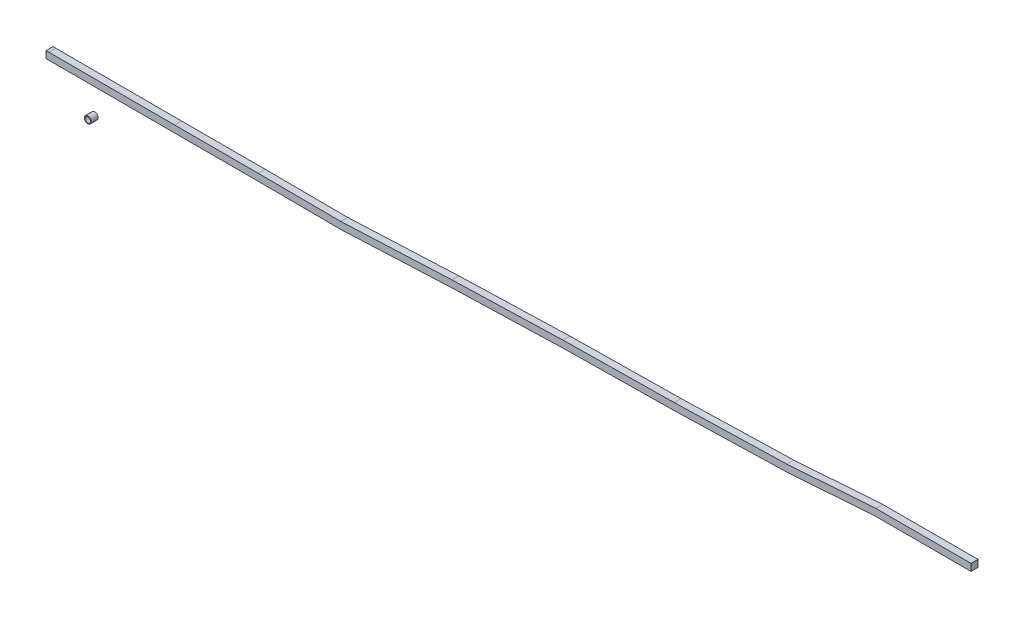
ISO-10303-21;
HEADER;
FILE_DESCRIPTION(('STEP AP214'),'2;1');
FILE_NAME('part.step','',(''),(''),'','','');
FILE_SCHEMA(('AUTOMOTIVE_DESIGN { 1 0 10303 214 1 1 1 1 }'));
ENDSEC;
DATA;
#1=APPLICATION_CONTEXT('core data for automotive mechanical design processes');
#2=APPLICATION_PROTOCOL_DEFINITION('international standard','automotive_design',2000,#1);
#3=PRODUCT_CONTEXT('',#1,'mechanical');
#4=PRODUCT('Part','Part','',(#3));
#5=PRODUCT_RELATED_PRODUCT_CATEGORY('part','',(#4));
#6=PRODUCT_DEFINITION_FORMATION('','',#4);
#7=PRODUCT_DEFINITION_CONTEXT('part definition',#1,'design');
#8=PRODUCT_DEFINITION('design','',#6,#7);
#9=PRODUCT_DEFINITION_SHAPE('','',#8);
#10=(LENGTH_UNIT() NAMED_UNIT(*) SI_UNIT(.MILLI.,.METRE.));
#11=(NAMED_UNIT(*) PLANE_ANGLE_UNIT() SI_UNIT($,.RADIAN.));
#12=(NAMED_UNIT(*) SI_UNIT($,.STERADIAN.) SOLID_ANGLE_UNIT());
#13=UNCERTAINTY_MEASURE_WITH_UNIT(LENGTH_MEASURE(1.E-05),#10,'distance_accuracy_value','');
#14=(GEOMETRIC_REPRESENTATION_CONTEXT(3) GLOBAL_UNCERTAINTY_ASSIGNED_CONTEXT((#13)) GLOBAL_UNIT_ASSIGNED_CONTEXT((#10,
#11,#12)) REPRESENTATION_CONTEXT('',''));
#15=CARTESIAN_POINT('',(0.,0.,0.));
#16=DIRECTION('',(0.,0.,1.));
#17=DIRECTION('',(1.,0.,0.));
#18=AXIS2_PLACEMENT_3D('',#15,#16,#17);
#19=CARTESIAN_POINT('',(558.344709293851,-48.9897495533135,5.));
#20=DIRECTION('',(-0.026840971940807,0.999639716210432,0.));
#21=DIRECTION('',(-0.999639716210432,-0.026840971940807,0.));
#22=AXIS2_PLACEMENT_3D('',#19,#20,#21);
#23=PLANE('',#22);
#24=DIRECTION('',(0.999639716210432,0.026840971940807,0.));
#25=VECTOR('',#24,1.);
#26=CARTESIAN_POINT('',(558.344709293851,-48.9897495533135,0.));
#27=LINE('',#26,#25);
#28=CARTESIAN_POINT('',(558.344709293851,-48.9897495533135,0.));
#29=VERTEX_POINT('',#28);
#30=CARTESIAN_POINT('',(639.38505307332,-46.8137639875297,0.));
#31=VERTEX_POINT('',#30);
#32=EDGE_CURVE('E223',#29,#31,#27,.T.);
#33=ORIENTED_EDGE('',*,*,#32,.T.);
#34=DIRECTION('',(0.,0.,-1.));
#35=VECTOR('',#34,1.);
#36=CARTESIAN_POINT('',(639.38505307332,-46.8137639875297,5.));
#37=LINE('',#36,#35);
#38=CARTESIAN_POINT('',(639.38505307332,-46.8137639875297,5.));
#39=VERTEX_POINT('',#38);
#40=EDGE_CURVE('E12',#39,#31,#37,.T.);
#41=ORIENTED_EDGE('',*,*,#40,.F.);
#42=DIRECTION('',(0.999639716210432,0.026840971940807,0.));
#43=VECTOR('',#42,1.);
#44=CARTESIAN_POINT('',(558.344709293851,-48.9897495533135,5.));
#45=LINE('',#44,#43);
#46=CARTESIAN_POINT('',(558.344709293851,-48.9897495533135,5.));
#47=VERTEX_POINT('',#46);
#48=EDGE_CURVE('E265',#47,#39,#45,.T.);
#49=ORIENTED_EDGE('',*,*,#48,.F.);
#50=DIRECTION('',(0.,0.,-1.));
#51=VECTOR('',#50,1.);
#52=CARTESIAN_POINT('',(558.344709293851,-48.9897495533135,5.));
#53=LINE('',#52,#51);
#54=EDGE_CURVE('E219',#47,#29,#53,.T.);
#55=ORIENTED_EDGE('',*,*,#54,.T.);
#56=EDGE_LOOP('',(#33,#41,#49,#55));
#57=FACE_BOUND('',#56,.T.);
#58=ADVANCED_FACE('F43',(#57),#23,.F.);
#59=CARTESIAN_POINT('',(639.38505307332,-46.8137639875297,5.));
#60=DIRECTION('',(-0.0683269676781056,0.997662981917198,0.));
#61=DIRECTION('',(-0.997662981917198,-0.0683269676781056,0.));
#62=AXIS2_PLACEMENT_3D('',#59,#60,#61);
#63=PLANE('',#62);
#64=DIRECTION('',(0.997662981917198,0.0683269676781055,0.));
#65=VECTOR('',#64,1.);
#66=CARTESIAN_POINT('',(639.38505307332,-46.8137639875297,0.));
#67=LINE('',#66,#65);
#68=CARTESIAN_POINT('',(703.528398770588,-42.4207771897229,0.));
#69=VERTEX_POINT('',#68);
#70=EDGE_CURVE('E226',#31,#69,#67,.T.);
#71=ORIENTED_EDGE('',*,*,#70,.T.);
#72=DIRECTION('',(0.,0.,-1.));
#73=VECTOR('',#72,1.);
#74=CARTESIAN_POINT('',(703.528398770588,-42.4207771897229,5.));
#75=LINE('',#74,#73);
#76=CARTESIAN_POINT('',(703.528398770588,-42.4207771897229,5.));
#77=VERTEX_POINT('',#76);
#78=EDGE_CURVE('E51',#77,#69,#75,.T.);
#79=ORIENTED_EDGE('',*,*,#78,.F.);
#80=DIRECTION('',(0.997662981917198,0.0683269676781055,0.));
#81=VECTOR('',#80,1.);
#82=CARTESIAN_POINT('',(639.38505307332,-46.8137639875297,5.));
#83=LINE('',#82,#81);
#84=EDGE_CURVE('E144',#39,#77,#83,.T.);
#85=ORIENTED_EDGE('',*,*,#84,.F.);
#86=ORIENTED_EDGE('',*,*,#40,.T.);
#87=EDGE_LOOP('',(#71,#79,#85,#86));
#88=FACE_BOUND('',#87,.T.);
#89=ADVANCED_FACE('F393',(#88),#63,.F.);
#90=CARTESIAN_POINT('',(703.528398770588,-42.4207771897229,5.));
#91=DIRECTION('',(0.,1.,0.));
#92=DIRECTION('',(0.,0.,1.));
#93=AXIS2_PLACEMENT_3D('',#90,#91,#92);
#94=PLANE('',#93);
#95=DIRECTION('',(1.,0.,0.));
#96=VECTOR('',#95,1.);
#97=CARTESIAN_POINT('',(703.528398770588,-42.4207771897229,0.));
#98=LINE('',#97,#96);
#99=CARTESIAN_POINT('',(771.971701744499,-42.4207771897229,0.));
#100=VERTEX_POINT('',#99);
#101=EDGE_CURVE('E228',#69,#100,#98,.T.);
#102=ORIENTED_EDGE('',*,*,#101,.T.);
#103=DIRECTION('',(0.,0.,-1.));
#104=VECTOR('',#103,1.);
#105=CARTESIAN_POINT('',(771.971701744499,-42.4207771897229,5.));
#106=LINE('',#105,#104);
#107=CARTESIAN_POINT('',(771.971701744499,-42.4207771897229,5.));
#108=VERTEX_POINT('',#107);
#109=EDGE_CURVE('E314',#108,#100,#106,.T.);
#110=ORIENTED_EDGE('',*,*,#109,.F.);
#111=DIRECTION('',(1.,0.,0.));
#112=VECTOR('',#111,1.);
#113=CARTESIAN_POINT('',(703.528398770588,-42.4207771897229,5.));
#114=LINE('',#113,#112);
#115=EDGE_CURVE('E322',#77,#108,#114,.T.);
#116=ORIENTED_EDGE('',*,*,#115,.F.);
#117=ORIENTED_EDGE('',*,*,#78,.T.);
#118=EDGE_LOOP('',(#102,#110,#116,#117));
#119=FACE_BOUND('',#118,.T.);
#120=ADVANCED_FACE('F320',(#119),#94,.F.);
#121=CARTESIAN_POINT('',(771.971701744499,-37.4207771897229,5.));
#122=DIRECTION('',(-1.,0.,0.));
#123=DIRECTION('',(0.,0.,1.));
#124=AXIS2_PLACEMENT_3D('',#121,#122,#123);
#125=PLANE('',#124);
#126=DIRECTION('',(0.,1.,0.));
#127=VECTOR('',#126,1.);
#128=CARTESIAN_POINT('',(771.971701744499,-37.4207771897229,0.));
#129=LINE('',#128,#127);
#130=CARTESIAN_POINT('',(771.971701744499,-37.4207771897229,0.));
#131=VERTEX_POINT('',#130);
#132=EDGE_CURVE('E230',#100,#131,#129,.T.);
#133=ORIENTED_EDGE('',*,*,#132,.T.);
#134=DIRECTION('',(0.,0.,-1.));
#135=VECTOR('',#134,1.);
#136=CARTESIAN_POINT('',(771.971701744499,-37.4207771897229,5.));
#137=LINE('',#136,#135);
#138=CARTESIAN_POINT('',(771.971701744499,-37.4207771897229,5.));
#139=VERTEX_POINT('',#138);
#140=EDGE_CURVE('E311',#139,#131,#137,.T.);
#141=ORIENTED_EDGE('',*,*,#140,.F.);
#142=DIRECTION('',(0.,1.,0.));
#143=VECTOR('',#142,1.);
#144=CARTESIAN_POINT('',(771.971701744499,-37.4207771897229,5.));
#145=LINE('',#144,#143);
#146=EDGE_CURVE('E340',#108,#139,#145,.T.);
#147=ORIENTED_EDGE('',*,*,#146,.F.);
#148=ORIENTED_EDGE('',*,*,#109,.T.);
#149=EDGE_LOOP('',(#133,#141,#147,#148));
#150=FACE_BOUND('',#149,.T.);
#151=ADVANCED_FACE('F331',(#150),#125,.F.);
#152=CARTESIAN_POINT('',(703.528398770588,-37.4207771897229,5.));
#153=DIRECTION('',(0.,-1.,0.));
#154=DIRECTION('',(0.,0.,-1.));
#155=AXIS2_PLACEMENT_3D('',#152,#153,#154);
#156=PLANE('',#155);
#157=DIRECTION('',(-1.,0.,0.));
#158=VECTOR('',#157,1.);
#159=CARTESIAN_POINT('',(703.528398770588,-37.4207771897229,0.));
#160=LINE('',#159,#158);
#161=CARTESIAN_POINT('',(703.528398770588,-37.4207771897229,0.));
#162=VERTEX_POINT('',#161);
#163=EDGE_CURVE('E232',#131,#162,#160,.T.);
#164=ORIENTED_EDGE('',*,*,#163,.T.);
#165=DIRECTION('',(0.,0.,-1.));
#166=VECTOR('',#165,1.);
#167=CARTESIAN_POINT('',(703.528398770588,-37.4207771897229,5.));
#168=LINE('',#167,#166);
#169=CARTESIAN_POINT('',(703.528398770588,-37.4207771897229,5.));
#170=VERTEX_POINT('',#169);
#171=EDGE_CURVE('E308',#170,#162,#168,.T.);
#172=ORIENTED_EDGE('',*,*,#171,.F.);
#173=DIRECTION('',(-1.,0.,0.));
#174=VECTOR('',#173,1.);
#175=CARTESIAN_POINT('',(703.528398770588,-37.4207771897229,5.));
#176=LINE('',#175,#174);
#177=EDGE_CURVE('E337',#139,#170,#176,.T.);
#178=ORIENTED_EDGE('',*,*,#177,.F.);
#179=ORIENTED_EDGE('',*,*,#140,.T.);
#180=EDGE_LOOP('',(#164,#172,#178,#179));
#181=FACE_BOUND('',#180,.T.);
#182=ADVANCED_FACE('F335',(#181),#156,.F.);
#183=CARTESIAN_POINT('',(639.38505307332,-41.8137639875297,5.));
#184=DIRECTION('',(0.0683269676781056,-0.997662981917198,0.));
#185=DIRECTION('',(0.997662981917198,0.0683269676781056,0.));
#186=AXIS2_PLACEMENT_3D('',#183,#184,#185);
#187=PLANE('',#186);
#188=DIRECTION('',(-0.997662981917198,-0.0683269676781055,0.));
#189=VECTOR('',#188,1.);
#190=CARTESIAN_POINT('',(639.38505307332,-41.8137639875297,0.));
#191=LINE('',#190,#189);
#192=CARTESIAN_POINT('',(639.38505307332,-41.8137639875297,0.));
#193=VERTEX_POINT('',#192);
#194=EDGE_CURVE('E234',#162,#193,#191,.T.);
#195=ORIENTED_EDGE('',*,*,#194,.T.);
#196=DIRECTION('',(0.,0.,-1.));
#197=VECTOR('',#196,1.);
#198=CARTESIAN_POINT('',(639.38505307332,-41.8137639875297,5.));
#199=LINE('',#198,#197);
#200=CARTESIAN_POINT('',(639.38505307332,-41.8137639875297,5.));
#201=VERTEX_POINT('',#200);
#202=EDGE_CURVE('E305',#201,#193,#199,.T.);
#203=ORIENTED_EDGE('',*,*,#202,.F.);
#204=DIRECTION('',(-0.997662981917198,-0.0683269676781055,0.));
#205=VECTOR('',#204,1.);
#206=CARTESIAN_POINT('',(639.38505307332,-41.8137639875297,5.));
#207=LINE('',#206,#205);
#208=EDGE_CURVE('E339',#170,#201,#207,.T.);
#209=ORIENTED_EDGE('',*,*,#208,.F.);
#210=ORIENTED_EDGE('',*,*,#171,.T.);
#211=EDGE_LOOP('',(#195,#203,#209,#210));
#212=FACE_BOUND('',#211,.T.);
#213=ADVANCED_FACE('F406',(#212),#187,.F.);
#214=CARTESIAN_POINT('',(558.344709293851,-43.9897495533135,5.));
#215=DIRECTION('',(0.026840971940807,-0.999639716210432,0.));
#216=DIRECTION('',(0.999639716210432,0.026840971940807,0.));
#217=AXIS2_PLACEMENT_3D('',#214,#215,#216);
#218=PLANE('',#217);
#219=DIRECTION('',(-0.999639716210432,-0.026840971940807,0.));
#220=VECTOR('',#219,1.);
#221=CARTESIAN_POINT('',(558.344709293851,-43.9897495533135,0.));
#222=LINE('',#221,#220);
#223=CARTESIAN_POINT('',(558.344709293851,-43.9897495533135,0.));
#224=VERTEX_POINT('',#223);
#225=EDGE_CURVE('E236',#193,#224,#222,.T.);
#226=ORIENTED_EDGE('',*,*,#225,.T.);
#227=DIRECTION('',(0.,0.,-1.));
#228=VECTOR('',#227,1.);
#229=CARTESIAN_POINT('',(558.344709293851,-43.9897495533135,5.));
#230=LINE('',#229,#228);
#231=CARTESIAN_POINT('',(558.344709293851,-43.9897495533135,5.));
#232=VERTEX_POINT('',#231);
#233=EDGE_CURVE('E302',#232,#224,#230,.T.);
#234=ORIENTED_EDGE('',*,*,#233,.F.);
#235=DIRECTION('',(-0.999639716210432,-0.026840971940807,0.));
#236=VECTOR('',#235,1.);
#237=CARTESIAN_POINT('',(558.344709293851,-43.9897495533135,5.));
#238=LINE('',#237,#236);
#239=EDGE_CURVE('E342',#201,#232,#238,.T.);
#240=ORIENTED_EDGE('',*,*,#239,.F.);
#241=ORIENTED_EDGE('',*,*,#202,.T.);
#242=EDGE_LOOP('',(#226,#234,#240,#241));
#243=FACE_BOUND('',#242,.T.);
#244=ADVANCED_FACE('F409',(#243),#218,.F.);
#245=CARTESIAN_POINT('',(478.38505307332,-45.0810076441578,5.));
#246=DIRECTION('',(0.0136463377816446,-0.999906884397317,0.));
#247=DIRECTION('',(0.999906884397317,0.0136463377816446,0.));
#248=AXIS2_PLACEMENT_3D('',#245,#246,#247);
#249=PLANE('',#248);
#250=DIRECTION('',(-0.999906884397317,-0.0136463377816446,0.));
#251=VECTOR('',#250,1.);
#252=CARTESIAN_POINT('',(478.38505307332,-45.0810076441578,0.));
#253=LINE('',#252,#251);
#254=CARTESIAN_POINT('',(478.38505307332,-45.0810076441578,0.));
#255=VERTEX_POINT('',#254);
#256=EDGE_CURVE('E238',#224,#255,#253,.T.);
#257=ORIENTED_EDGE('',*,*,#256,.T.);
#258=DIRECTION('',(0.,0.,-1.));
#259=VECTOR('',#258,1.);
#260=CARTESIAN_POINT('',(478.38505307332,-45.0810076441578,5.));
#261=LINE('',#260,#259);
#262=CARTESIAN_POINT('',(478.38505307332,-45.0810076441578,5.));
#263=VERTEX_POINT('',#262);
#264=EDGE_CURVE('E299',#263,#255,#261,.T.);
#265=ORIENTED_EDGE('',*,*,#264,.F.);
#266=DIRECTION('',(-0.999906884397317,-0.0136463377816446,0.));
#267=VECTOR('',#266,1.);
#268=CARTESIAN_POINT('',(478.38505307332,-45.0810076441578,5.));
#269=LINE('',#268,#267);
#270=EDGE_CURVE('E348',#232,#263,#269,.T.);
#271=ORIENTED_EDGE('',*,*,#270,.F.);
#272=ORIENTED_EDGE('',*,*,#233,.T.);
#273=EDGE_LOOP('',(#257,#265,#271,#272));
#274=FACE_BOUND('',#273,.T.);
#275=ADVANCED_FACE('F413',(#274),#249,.F.);
#276=CARTESIAN_POINT('',(398.350063341379,-47.5031713785995,5.));
#277=DIRECTION('',(0.0302499603762834,-0.999542365233827,0.));
#278=DIRECTION('',(0.999542365233827,0.0302499603762834,0.));
#279=AXIS2_PLACEMENT_3D('',#276,#277,#278);
#280=PLANE('',#279);
#281=DIRECTION('',(-0.999542365233827,-0.0302499603762834,0.));
#282=VECTOR('',#281,1.);
#283=CARTESIAN_POINT('',(398.350063341379,-47.5031713785995,0.));
#284=LINE('',#283,#282);
#285=CARTESIAN_POINT('',(398.350063341379,-47.5031713785995,0.));
#286=VERTEX_POINT('',#285);
#287=EDGE_CURVE('E240',#255,#286,#284,.T.);
#288=ORIENTED_EDGE('',*,*,#287,.T.);
#289=DIRECTION('',(0.,0.,-1.));
#290=VECTOR('',#289,1.);
#291=CARTESIAN_POINT('',(398.350063341379,-47.5031713785995,5.));
#292=LINE('',#291,#290);
#293=CARTESIAN_POINT('',(398.350063341379,-47.5031713785995,5.));
#294=VERTEX_POINT('',#293);
#295=EDGE_CURVE('E296',#294,#286,#292,.T.);
#296=ORIENTED_EDGE('',*,*,#295,.F.);
#297=DIRECTION('',(-0.999542365233827,-0.0302499603762834,0.));
#298=VECTOR('',#297,1.);
#299=CARTESIAN_POINT('',(398.350063341379,-47.5031713785995,5.));
#300=LINE('',#299,#298);
#301=EDGE_CURVE('E350',#263,#294,#300,.T.);
#302=ORIENTED_EDGE('',*,*,#301,.F.);
#303=ORIENTED_EDGE('',*,*,#264,.T.);
#304=EDGE_LOOP('',(#288,#296,#302,#303));
#305=FACE_BOUND('',#304,.T.);
#306=ADVANCED_FACE('F417',(#305),#280,.F.);
#307=CARTESIAN_POINT('',(318.379120522438,-51.0945651545392,5.));
#308=DIRECTION('',(0.0448635162580581,-0.998993125556409,0.));
#309=DIRECTION('',(0.998993125556409,0.0448635162580581,0.));
#310=AXIS2_PLACEMENT_3D('',#307,#308,#309);
#311=PLANE('',#310);
#312=DIRECTION('',(-0.998993125556409,-0.0448635162580581,0.));
#313=VECTOR('',#312,1.);
#314=CARTESIAN_POINT('',(318.379120522438,-51.0945651545392,0.));
#315=LINE('',#314,#313);
#316=CARTESIAN_POINT('',(318.379120522438,-51.0945651545392,0.));
#317=VERTEX_POINT('',#316);
#318=EDGE_CURVE('E242',#286,#317,#315,.T.);
#319=ORIENTED_EDGE('',*,*,#318,.T.);
#320=DIRECTION('',(0.,0.,-1.));
#321=VECTOR('',#320,1.);
#322=CARTESIAN_POINT('',(318.379120522438,-51.0945651545392,5.));
#323=LINE('',#322,#321);
#324=CARTESIAN_POINT('',(318.379120522438,-51.0945651545392,5.));
#325=VERTEX_POINT('',#324);
#326=EDGE_CURVE('E293',#325,#317,#323,.T.);
#327=ORIENTED_EDGE('',*,*,#326,.F.);
#328=DIRECTION('',(-0.998993125556409,-0.0448635162580581,0.));
#329=VECTOR('',#328,1.);
#330=CARTESIAN_POINT('',(318.379120522438,-51.0945651545392,5.));
#331=LINE('',#330,#329);
#332=EDGE_CURVE('E352',#294,#325,#331,.T.);
#333=ORIENTED_EDGE('',*,*,#332,.F.);
#334=ORIENTED_EDGE('',*,*,#295,.T.);
#335=EDGE_LOOP('',(#319,#327,#333,#334));
#336=FACE_BOUND('',#335,.T.);
#337=ADVANCED_FACE('F421',(#336),#311,.F.);
#338=CARTESIAN_POINT('',(259.129657457669,-50.7618852118287,5.));
#339=DIRECTION('',(-0.0056148137283432,-0.999984236809159,0.));
#340=DIRECTION('',(0.999984236809159,-0.0056148137283432,0.));
#341=AXIS2_PLACEMENT_3D('',#338,#339,#340);
#342=PLANE('',#341);
#343=DIRECTION('',(-0.999984236809159,0.0056148137283432,0.));
#344=VECTOR('',#343,1.);
#345=CARTESIAN_POINT('',(259.129657457669,-50.7618852118287,0.));
#346=LINE('',#345,#344);
#347=CARTESIAN_POINT('',(259.129657457669,-50.7618852118287,0.));
#348=VERTEX_POINT('',#347);
#349=EDGE_CURVE('E244',#317,#348,#346,.T.);
#350=ORIENTED_EDGE('',*,*,#349,.T.);
#351=DIRECTION('',(0.,0.,-1.));
#352=VECTOR('',#351,1.);
#353=CARTESIAN_POINT('',(259.129657457669,-50.7618852118287,5.));
#354=LINE('',#353,#352);
#355=CARTESIAN_POINT('',(259.129657457669,-50.7618852118287,5.));
#356=VERTEX_POINT('',#355);
#357=EDGE_CURVE('E290',#356,#348,#354,.T.);
#358=ORIENTED_EDGE('',*,*,#357,.F.);
#359=DIRECTION('',(-0.999984236809159,0.0056148137283432,0.));
#360=VECTOR('',#359,1.);
#361=CARTESIAN_POINT('',(259.129657457669,-50.7618852118287,5.));
#362=LINE('',#361,#360);
#363=EDGE_CURVE('E354',#325,#356,#362,.T.);
#364=ORIENTED_EDGE('',*,*,#363,.F.);
#365=ORIENTED_EDGE('',*,*,#326,.T.);
#366=EDGE_LOOP('',(#350,#358,#364,#365));
#367=FACE_BOUND('',#366,.T.);
#368=ADVANCED_FACE('F425',(#367),#342,.F.);
#369=CARTESIAN_POINT('',(198.77225041504,-50.7618852118287,5.));
#370=DIRECTION('',(0.,-1.,0.));
#371=DIRECTION('',(0.,0.,-1.));
#372=AXIS2_PLACEMENT_3D('',#369,#370,#371);
#373=PLANE('',#372);
#374=DIRECTION('',(-1.,0.,0.));
#375=VECTOR('',#374,1.);
#376=CARTESIAN_POINT('',(198.77225041504,-50.7618852118287,0.));
#377=LINE('',#376,#375);
#378=CARTESIAN_POINT('',(198.77225041504,-50.7618852118287,0.));
#379=VERTEX_POINT('',#378);
#380=EDGE_CURVE('E246',#348,#379,#377,.T.);
#381=ORIENTED_EDGE('',*,*,#380,.T.);
#382=DIRECTION('',(0.,0.,-1.));
#383=VECTOR('',#382,1.);
#384=CARTESIAN_POINT('',(198.77225041504,-50.7618852118287,5.));
#385=LINE('',#384,#383);
#386=CARTESIAN_POINT('',(198.77225041504,-50.7618852118287,5.));
#387=VERTEX_POINT('',#386);
#388=EDGE_CURVE('E287',#387,#379,#385,.T.);
#389=ORIENTED_EDGE('',*,*,#388,.F.);
#390=DIRECTION('',(-1.,0.,0.));
#391=VECTOR('',#390,1.);
#392=CARTESIAN_POINT('',(198.77225041504,-50.7618852118287,5.));
#393=LINE('',#392,#391);
#394=EDGE_CURVE('E356',#356,#387,#393,.T.);
#395=ORIENTED_EDGE('',*,*,#394,.F.);
#396=ORIENTED_EDGE('',*,*,#357,.T.);
#397=EDGE_LOOP('',(#381,#389,#395,#396));
#398=FACE_BOUND('',#397,.T.);
#399=ADVANCED_FACE('F429',(#398),#373,.F.);
#400=CARTESIAN_POINT('',(108.322443372219,-50.6665245463066,5.));
#401=DIRECTION('',(-0.00105429315596679,-0.999999444232816,0.));
#402=DIRECTION('',(0.999999444232816,-0.00105429315596679,0.));
#403=AXIS2_PLACEMENT_3D('',#400,#401,#402);
#404=PLANE('',#403);
#405=DIRECTION('',(-0.999999444232816,0.00105429315596679,0.));
#406=VECTOR('',#405,1.);
#407=CARTESIAN_POINT('',(108.322443372219,-50.6665245463066,0.));
#408=LINE('',#407,#406);
#409=CARTESIAN_POINT('',(108.322443372219,-50.6665245463066,0.));
#410=VERTEX_POINT('',#409);
#411=EDGE_CURVE('E248',#379,#410,#408,.T.);
#412=ORIENTED_EDGE('',*,*,#411,.T.);
#413=DIRECTION('',(0.,0.,-1.));
#414=VECTOR('',#413,1.);
#415=CARTESIAN_POINT('',(108.322443372219,-50.6665245463066,5.));
#416=LINE('',#415,#414);
#417=CARTESIAN_POINT('',(108.322443372219,-50.6665245463066,5.));
#418=VERTEX_POINT('',#417);
#419=EDGE_CURVE('E284',#418,#410,#416,.T.);
#420=ORIENTED_EDGE('',*,*,#419,.F.);
#421=DIRECTION('',(-0.999999444232816,0.00105429315596679,0.));
#422=VECTOR('',#421,1.);
#423=CARTESIAN_POINT('',(108.322443372219,-50.6665245463066,5.));
#424=LINE('',#423,#422);
#425=EDGE_CURVE('E358',#387,#418,#424,.T.);
#426=ORIENTED_EDGE('',*,*,#425,.F.);
#427=ORIENTED_EDGE('',*,*,#388,.T.);
#428=EDGE_LOOP('',(#412,#420,#426,#427));
#429=FACE_BOUND('',#428,.T.);
#430=ADVANCED_FACE('F433',(#429),#404,.F.);
#431=CARTESIAN_POINT('',(108.322443372219,-50.6665245463066,5.));
#432=DIRECTION('',(0.,-1.,0.));
#433=DIRECTION('',(0.,0.,-1.));
#434=AXIS2_PLACEMENT_3D('',#431,#432,#433);
#435=PLANE('',#434);
#436=DIRECTION('',(-1.,0.,0.));
#437=VECTOR('',#436,1.);
#438=CARTESIAN_POINT('',(108.322443372219,-50.6665245463066,0.));
#439=LINE('',#438,#437);
#440=CARTESIAN_POINT('',(106.322443372219,-50.6665245463066,0.));
#441=VERTEX_POINT('',#440);
#442=EDGE_CURVE('E250',#410,#441,#439,.T.);
#443=ORIENTED_EDGE('',*,*,#442,.T.);
#444=DIRECTION('',(0.,0.,-1.));
#445=VECTOR('',#444,1.);
#446=CARTESIAN_POINT('',(106.322443372219,-50.6665245463066,5.));
#447=LINE('',#446,#445);
#448=CARTESIAN_POINT('',(106.322443372219,-50.6665245463066,5.));
#449=VERTEX_POINT('',#448);
#450=EDGE_CURVE('E281',#449,#441,#447,.T.);
#451=ORIENTED_EDGE('',*,*,#450,.F.);
#452=DIRECTION('',(-1.,0.,0.));
#453=VECTOR('',#452,1.);
#454=CARTESIAN_POINT('',(108.322443372219,-50.6665245463066,5.));
#455=LINE('',#454,#453);
#456=EDGE_CURVE('E360',#418,#449,#455,.T.);
#457=ORIENTED_EDGE('',*,*,#456,.F.);
#458=ORIENTED_EDGE('',*,*,#419,.T.);
#459=EDGE_LOOP('',(#443,#451,#457,#458));
#460=FACE_BOUND('',#459,.T.);
#461=ADVANCED_FACE('F437',(#460),#435,.F.);
#462=CARTESIAN_POINT('',(106.322443372219,-50.6665245463066,5.));
#463=DIRECTION('',(1.,0.,0.));
#464=DIRECTION('',(0.,0.,-1.));
#465=AXIS2_PLACEMENT_3D('',#462,#463,#464);
#466=PLANE('',#465);
#467=DIRECTION('',(0.,-1.,0.));
#468=VECTOR('',#467,1.);
#469=CARTESIAN_POINT('',(106.322443372219,-50.6665245463066,0.));
#470=LINE('',#469,#468);
#471=CARTESIAN_POINT('',(106.322443372219,-55.6665245463066,0.));
#472=VERTEX_POINT('',#471);
#473=EDGE_CURVE('E252',#441,#472,#470,.T.);
#474=ORIENTED_EDGE('',*,*,#473,.T.);
#475=DIRECTION('',(0.,0.,-1.));
#476=VECTOR('',#475,1.);
#477=CARTESIAN_POINT('',(106.322443372219,-55.6665245463066,5.));
#478=LINE('',#477,#476);
#479=CARTESIAN_POINT('',(106.322443372219,-55.6665245463066,5.));
#480=VERTEX_POINT('',#479);
#481=EDGE_CURVE('E278',#480,#472,#478,.T.);
#482=ORIENTED_EDGE('',*,*,#481,.F.);
#483=DIRECTION('',(0.,-1.,0.));
#484=VECTOR('',#483,1.);
#485=CARTESIAN_POINT('',(106.322443372219,-50.6665245463066,5.));
#486=LINE('',#485,#484);
#487=EDGE_CURVE('E362',#449,#480,#486,.T.);
#488=ORIENTED_EDGE('',*,*,#487,.F.);
#489=ORIENTED_EDGE('',*,*,#450,.T.);
#490=EDGE_LOOP('',(#474,#482,#488,#489));
#491=FACE_BOUND('',#490,.T.);
#492=ADVANCED_FACE('F441',(#491),#466,.F.);
#493=CARTESIAN_POINT('',(108.322443372219,-55.6665245463066,5.));
#494=DIRECTION('',(0.,1.,0.));
#495=DIRECTION('',(0.,0.,1.));
#496=AXIS2_PLACEMENT_3D('',#493,#494,#495);
#497=PLANE('',#496);
#498=DIRECTION('',(1.,0.,0.));
#499=VECTOR('',#498,1.);
#500=CARTESIAN_POINT('',(108.322443372219,-55.6665245463066,0.));
#501=LINE('',#500,#499);
#502=CARTESIAN_POINT('',(108.322443372219,-55.6665245463066,0.));
#503=VERTEX_POINT('',#502);
#504=EDGE_CURVE('E254',#472,#503,#501,.T.);
#505=ORIENTED_EDGE('',*,*,#504,.T.);
#506=DIRECTION('',(0.,0.,-1.));
#507=VECTOR('',#506,1.);
#508=CARTESIAN_POINT('',(108.322443372219,-55.6665245463066,5.));
#509=LINE('',#508,#507);
#510=CARTESIAN_POINT('',(108.322443372219,-55.6665245463066,5.));
#511=VERTEX_POINT('',#510);
#512=EDGE_CURVE('E275',#511,#503,#509,.T.);
#513=ORIENTED_EDGE('',*,*,#512,.F.);
#514=DIRECTION('',(1.,0.,0.));
#515=VECTOR('',#514,1.);
#516=CARTESIAN_POINT('',(108.322443372219,-55.6665245463066,5.));
#517=LINE('',#516,#515);
#518=EDGE_CURVE('E364',#480,#511,#517,.T.);
#519=ORIENTED_EDGE('',*,*,#518,.F.);
#520=ORIENTED_EDGE('',*,*,#481,.T.);
#521=EDGE_LOOP('',(#505,#513,#519,#520));
#522=FACE_BOUND('',#521,.T.);
#523=ADVANCED_FACE('F445',(#522),#497,.F.);
#524=CARTESIAN_POINT('',(108.322443372219,-55.6665245463066,5.));
#525=DIRECTION('',(0.00105429315596679,0.999999444232816,0.));
#526=DIRECTION('',(-0.999999444232816,0.00105429315596679,0.));
#527=AXIS2_PLACEMENT_3D('',#524,#525,#526);
#528=PLANE('',#527);
#529=DIRECTION('',(0.999999444232816,-0.00105429315596679,0.));
#530=VECTOR('',#529,1.);
#531=CARTESIAN_POINT('',(108.322443372219,-55.6665245463066,0.));
#532=LINE('',#531,#530);
#533=CARTESIAN_POINT('',(198.77225041504,-55.7618852118287,0.));
#534=VERTEX_POINT('',#533);
#535=EDGE_CURVE('E256',#503,#534,#532,.T.);
#536=ORIENTED_EDGE('',*,*,#535,.T.);
#537=DIRECTION('',(0.,0.,-1.));
#538=VECTOR('',#537,1.);
#539=CARTESIAN_POINT('',(198.77225041504,-55.7618852118287,5.));
#540=LINE('',#539,#538);
#541=CARTESIAN_POINT('',(198.77225041504,-55.7618852118287,5.));
#542=VERTEX_POINT('',#541);
#543=EDGE_CURVE('E272',#542,#534,#540,.T.);
#544=ORIENTED_EDGE('',*,*,#543,.F.);
#545=DIRECTION('',(0.999999444232816,-0.00105429315596679,0.));
#546=VECTOR('',#545,1.);
#547=CARTESIAN_POINT('',(108.322443372219,-55.6665245463066,5.));
#548=LINE('',#547,#546);
#549=EDGE_CURVE('E366',#511,#542,#548,.T.);
#550=ORIENTED_EDGE('',*,*,#549,.F.);
#551=ORIENTED_EDGE('',*,*,#512,.T.);
#552=EDGE_LOOP('',(#536,#544,#550,#551));
#553=FACE_BOUND('',#552,.T.);
#554=ADVANCED_FACE('F449',(#553),#528,.F.);
#555=CARTESIAN_POINT('',(198.77225041504,-55.7618852118287,5.));
#556=DIRECTION('',(0.,1.,0.));
#557=DIRECTION('',(0.,0.,1.));
#558=AXIS2_PLACEMENT_3D('',#555,#556,#557);
#559=PLANE('',#558);
#560=DIRECTION('',(1.,0.,0.));
#561=VECTOR('',#560,1.);
#562=CARTESIAN_POINT('',(198.77225041504,-55.7618852118287,0.));
#563=LINE('',#562,#561);
#564=CARTESIAN_POINT('',(259.129657457669,-55.7618852118287,0.));
#565=VERTEX_POINT('',#564);
#566=EDGE_CURVE('E258',#534,#565,#563,.T.);
#567=ORIENTED_EDGE('',*,*,#566,.T.);
#568=DIRECTION('',(0.,0.,-1.));
#569=VECTOR('',#568,1.);
#570=CARTESIAN_POINT('',(259.129657457669,-55.7618852118287,5.));
#571=LINE('',#570,#569);
#572=CARTESIAN_POINT('',(259.129657457669,-55.7618852118287,5.));
#573=VERTEX_POINT('',#572);
#574=EDGE_CURVE('E269',#573,#565,#571,.T.);
#575=ORIENTED_EDGE('',*,*,#574,.F.);
#576=DIRECTION('',(1.,0.,0.));
#577=VECTOR('',#576,1.);
#578=CARTESIAN_POINT('',(198.77225041504,-55.7618852118287,5.));
#579=LINE('',#578,#577);
#580=EDGE_CURVE('E368',#542,#573,#579,.T.);
#581=ORIENTED_EDGE('',*,*,#580,.F.);
#582=ORIENTED_EDGE('',*,*,#543,.T.);
#583=EDGE_LOOP('',(#567,#575,#581,#582));
#584=FACE_BOUND('',#583,.T.);
#585=ADVANCED_FACE('F374',(#584),#559,.F.);
#586=CARTESIAN_POINT('',(259.129657457669,-55.7618852118287,5.));
#587=DIRECTION('',(0.00561481372834332,0.999984236809159,0.));
#588=DIRECTION('',(-0.999984236809159,0.00561481372834332,0.));
#589=AXIS2_PLACEMENT_3D('',#586,#587,#588);
#590=PLANE('',#589);
#591=DIRECTION('',(0.999984236809159,-0.00561481372834332,0.));
#592=VECTOR('',#591,1.);
#593=CARTESIAN_POINT('',(259.129657457669,-55.7618852118287,0.));
#594=LINE('',#593,#592);
#595=CARTESIAN_POINT('',(318.379120522438,-56.0945651545392,0.));
#596=VERTEX_POINT('',#595);
#597=EDGE_CURVE('E260',#565,#596,#594,.T.);
#598=ORIENTED_EDGE('',*,*,#597,.T.);
#599=DIRECTION('',(0.,0.,-1.));
#600=VECTOR('',#599,1.);
#601=CARTESIAN_POINT('',(318.379120522438,-56.0945651545392,5.));
#602=LINE('',#601,#600);
#603=CARTESIAN_POINT('',(318.379120522438,-56.0945651545392,5.));
#604=VERTEX_POINT('',#603);
#605=EDGE_CURVE('E214',#604,#596,#602,.T.);
#606=ORIENTED_EDGE('',*,*,#605,.F.);
#607=DIRECTION('',(0.999984236809159,-0.00561481372834332,0.));
#608=VECTOR('',#607,1.);
#609=CARTESIAN_POINT('',(259.129657457669,-55.7618852118287,5.));
#610=LINE('',#609,#608);
#611=EDGE_CURVE('E205',#573,#604,#610,.T.);
#612=ORIENTED_EDGE('',*,*,#611,.F.);
#613=ORIENTED_EDGE('',*,*,#574,.T.);
#614=EDGE_LOOP('',(#598,#606,#612,#613));
#615=FACE_BOUND('',#614,.T.);
#616=ADVANCED_FACE('F378',(#615),#590,.F.);
#617=CARTESIAN_POINT('',(318.379120522438,-56.0945651545392,5.));
#618=DIRECTION('',(-0.0448635162580581,0.998993125556409,0.));
#619=DIRECTION('',(-0.998993125556409,-0.0448635162580581,0.));
#620=AXIS2_PLACEMENT_3D('',#617,#618,#619);
#621=PLANE('',#620);
#622=DIRECTION('',(0.998993125556409,0.0448635162580581,0.));
#623=VECTOR('',#622,1.);
#624=CARTESIAN_POINT('',(318.379120522438,-56.0945651545392,0.));
#625=LINE('',#624,#623);
#626=CARTESIAN_POINT('',(398.350063341379,-52.5031713785995,0.));
#627=VERTEX_POINT('',#626);
#628=EDGE_CURVE('E213',#596,#627,#625,.T.);
#629=ORIENTED_EDGE('',*,*,#628,.T.);
#630=DIRECTION('',(0.,0.,-1.));
#631=VECTOR('',#630,1.);
#632=CARTESIAN_POINT('',(398.350063341379,-52.5031713785995,5.));
#633=LINE('',#632,#631);
#634=CARTESIAN_POINT('',(398.350063341379,-52.5031713785995,5.));
#635=VERTEX_POINT('',#634);
#636=EDGE_CURVE('E210',#635,#627,#633,.T.);
#637=ORIENTED_EDGE('',*,*,#636,.F.);
#638=DIRECTION('',(0.998993125556409,0.0448635162580581,0.));
#639=VECTOR('',#638,1.);
#640=CARTESIAN_POINT('',(318.379120522438,-56.0945651545392,5.));
#641=LINE('',#640,#639);
#642=EDGE_CURVE('E199',#604,#635,#641,.T.);
#643=ORIENTED_EDGE('',*,*,#642,.F.);
#644=ORIENTED_EDGE('',*,*,#605,.T.);
#645=EDGE_LOOP('',(#629,#637,#643,#644));
#646=FACE_BOUND('',#645,.T.);
#647=ADVANCED_FACE('F211',(#646),#621,.F.);
#648=CARTESIAN_POINT('',(398.350063341379,-52.5031713785995,5.));
#649=DIRECTION('',(-0.0302499603762835,0.999542365233827,0.));
#650=DIRECTION('',(-0.999542365233827,-0.0302499603762835,0.));
#651=AXIS2_PLACEMENT_3D('',#648,#649,#650);
#652=PLANE('',#651);
#653=DIRECTION('',(0.999542365233827,0.0302499603762835,0.));
#654=VECTOR('',#653,1.);
#655=CARTESIAN_POINT('',(398.350063341379,-52.5031713785995,0.));
#656=LINE('',#655,#654);
#657=CARTESIAN_POINT('',(478.38505307332,-50.0810076441578,0.));
#658=VERTEX_POINT('',#657);
#659=EDGE_CURVE('E130',#627,#658,#656,.T.);
#660=ORIENTED_EDGE('',*,*,#659,.T.);
#661=DIRECTION('',(0.,0.,-1.));
#662=VECTOR('',#661,1.);
#663=CARTESIAN_POINT('',(478.38505307332,-50.0810076441578,5.));
#664=LINE('',#663,#662);
#665=CARTESIAN_POINT('',(478.38505307332,-50.0810076441578,5.));
#666=VERTEX_POINT('',#665);
#667=EDGE_CURVE('E215',#666,#658,#664,.T.);
#668=ORIENTED_EDGE('',*,*,#667,.F.);
#669=DIRECTION('',(0.999542365233827,0.0302499603762835,0.));
#670=VECTOR('',#669,1.);
#671=CARTESIAN_POINT('',(398.350063341379,-52.5031713785995,5.));
#672=LINE('',#671,#670);
#673=EDGE_CURVE('E203',#635,#666,#672,.T.);
#674=ORIENTED_EDGE('',*,*,#673,.F.);
#675=ORIENTED_EDGE('',*,*,#636,.T.);
#676=EDGE_LOOP('',(#660,#668,#674,#675));
#677=FACE_BOUND('',#676,.T.);
#678=ADVANCED_FACE('F217',(#677),#652,.F.);
#679=CARTESIAN_POINT('',(478.38505307332,-50.0810076441578,5.));
#680=DIRECTION('',(-0.0136463377816446,0.999906884397317,0.));
#681=DIRECTION('',(-0.999906884397317,-0.0136463377816446,0.));
#682=AXIS2_PLACEMENT_3D('',#679,#680,#681);
#683=PLANE('',#682);
#684=DIRECTION('',(0.999906884397317,0.0136463377816446,0.));
#685=VECTOR('',#684,1.);
#686=CARTESIAN_POINT('',(478.38505307332,-50.0810076441578,0.));
#687=LINE('',#686,#685);
#688=EDGE_CURVE('E136',#658,#29,#687,.T.);
#689=ORIENTED_EDGE('',*,*,#688,.T.);
#690=ORIENTED_EDGE('',*,*,#54,.F.);
#691=DIRECTION('',(0.999906884397317,0.0136463377816446,0.));
#692=VECTOR('',#691,1.);
#693=CARTESIAN_POINT('',(478.38505307332,-50.0810076441578,5.));
#694=LINE('',#693,#692);
#695=EDGE_CURVE('E59',#666,#47,#694,.T.);
#696=ORIENTED_EDGE('',*,*,#695,.F.);
#697=ORIENTED_EDGE('',*,*,#667,.T.);
#698=EDGE_LOOP('',(#689,#690,#696,#697));
#699=FACE_BOUND('',#698,.T.);
#700=ADVANCED_FACE('F382',(#699),#683,.F.);
#701=CARTESIAN_POINT('',(0.,0.,5.));
#702=DIRECTION('',(0.,0.,-1.));
#703=DIRECTION('',(-1.,0.,0.));
#704=AXIS2_PLACEMENT_3D('',#701,#702,#703);
#705=PLANE('',#704);
#706=ORIENTED_EDGE('',*,*,#48,.T.);
#707=ORIENTED_EDGE('',*,*,#84,.T.);
#708=ORIENTED_EDGE('',*,*,#115,.T.);
#709=ORIENTED_EDGE('',*,*,#146,.T.);
#710=ORIENTED_EDGE('',*,*,#177,.T.);
#711=ORIENTED_EDGE('',*,*,#208,.T.);
#712=ORIENTED_EDGE('',*,*,#239,.T.);
#713=ORIENTED_EDGE('',*,*,#270,.T.);
#714=ORIENTED_EDGE('',*,*,#301,.T.);
#715=ORIENTED_EDGE('',*,*,#332,.T.);
#716=ORIENTED_EDGE('',*,*,#363,.T.);
#717=ORIENTED_EDGE('',*,*,#394,.T.);
#718=ORIENTED_EDGE('',*,*,#425,.T.);
#719=ORIENTED_EDGE('',*,*,#456,.T.);
#720=ORIENTED_EDGE('',*,*,#487,.T.);
#721=ORIENTED_EDGE('',*,*,#518,.T.);
#722=ORIENTED_EDGE('',*,*,#549,.T.);
#723=ORIENTED_EDGE('',*,*,#580,.T.);
#724=ORIENTED_EDGE('',*,*,#611,.T.);
#725=ORIENTED_EDGE('',*,*,#642,.T.);
#726=ORIENTED_EDGE('',*,*,#673,.T.);
#727=ORIENTED_EDGE('',*,*,#695,.T.);
#728=EDGE_LOOP('',(#706,#707,#708,#709,#710,#711,#712,#713,#714,#715,#716,#717,#718,#719,#720,
#721,#722,#723,#724,#725,#726,#727));
#729=FACE_BOUND('',#728,.T.);
#730=ADVANCED_FACE('F201',(#729),#705,.F.);
#731=CARTESIAN_POINT('',(0.,0.,0.));
#732=DIRECTION('',(0.,0.,-1.));
#733=DIRECTION('',(-1.,0.,0.));
#734=AXIS2_PLACEMENT_3D('',#731,#732,#733);
#735=PLANE('',#734);
#736=ORIENTED_EDGE('',*,*,#32,.F.);
#737=ORIENTED_EDGE('',*,*,#688,.F.);
#738=ORIENTED_EDGE('',*,*,#659,.F.);
#739=ORIENTED_EDGE('',*,*,#628,.F.);
#740=ORIENTED_EDGE('',*,*,#597,.F.);
#741=ORIENTED_EDGE('',*,*,#566,.F.);
#742=ORIENTED_EDGE('',*,*,#535,.F.);
#743=ORIENTED_EDGE('',*,*,#504,.F.);
#744=ORIENTED_EDGE('',*,*,#473,.F.);
#745=ORIENTED_EDGE('',*,*,#442,.F.);
#746=ORIENTED_EDGE('',*,*,#411,.F.);
#747=ORIENTED_EDGE('',*,*,#380,.F.);
#748=ORIENTED_EDGE('',*,*,#349,.F.);
#749=ORIENTED_EDGE('',*,*,#318,.F.);
#750=ORIENTED_EDGE('',*,*,#287,.F.);
#751=ORIENTED_EDGE('',*,*,#256,.F.);
#752=ORIENTED_EDGE('',*,*,#225,.F.);
#753=ORIENTED_EDGE('',*,*,#194,.F.);
#754=ORIENTED_EDGE('',*,*,#163,.F.);
#755=ORIENTED_EDGE('',*,*,#132,.F.);
#756=ORIENTED_EDGE('',*,*,#101,.F.);
#757=ORIENTED_EDGE('',*,*,#70,.F.);
#758=EDGE_LOOP('',(#736,#737,#738,#739,#740,#741,#742,#743,#744,#745,#746,#747,#748,#749,#750,
#751,#752,#753,#754,#755,#756,#757));
#759=FACE_BOUND('',#758,.T.);
#760=ADVANCED_FACE('F326',(#759),#735,.T.);
#761=CLOSED_SHELL('',(#58,#89,#120,#151,#182,#213,#244,#275,#306,#337,#368,#399,#430,#461,#492,
#523,#554,#585,#616,#647,#678,#700,#730,#760));
#762=MANIFOLD_SOLID_BREP('B2',#761);
#763=CARTESIAN_POINT('',(136.352657781134,-78.7728889149614,5.));
#764=DIRECTION('',(0.,0.,1.));
#765=DIRECTION('',(1.,0.,0.));
#766=AXIS2_PLACEMENT_3D('',#763,#764,#765);
#767=PLANE('',#766);
#768=CARTESIAN_POINT('',(136.352657781134,-78.7728889149614,5.));
#769=DIRECTION('',(0.,0.,1.));
#770=DIRECTION('',(1.,0.,0.));
#771=AXIS2_PLACEMENT_3D('',#768,#769,#770);
#772=CIRCLE('',#771,2.5);
#773=CARTESIAN_POINT('',(138.852657781134,-78.7728889149614,5.));
#774=VERTEX_POINT('',#773);
#775=EDGE_CURVE('E42',#774,#774,#772,.T.);
#776=ORIENTED_EDGE('',*,*,#775,.T.);
#777=EDGE_LOOP('',(#776));
#778=FACE_BOUND('',#777,.T.);
#779=CARTESIAN_POINT('',(136.352657781134,-78.7728889149614,5.));
#780=DIRECTION('',(0.,0.,1.));
#781=DIRECTION('',(1.,0.,0.));
#782=AXIS2_PLACEMENT_3D('',#779,#780,#781);
#783=CIRCLE('',#782,2.);
#784=CARTESIAN_POINT('',(138.352657781134,-78.7728889149614,5.));
#785=VERTEX_POINT('',#784);
#786=EDGE_CURVE('E646',#785,#785,#783,.T.);
#787=ORIENTED_EDGE('',*,*,#786,.F.);
#788=EDGE_LOOP('',(#787));
#789=FACE_BOUND('',#788,.T.);
#790=ADVANCED_FACE('F635',(#778,#789),#767,.T.);
#791=CARTESIAN_POINT('',(136.352657781134,-78.7728889149614,0.));
#792=DIRECTION('',(0.,0.,1.));
#793=DIRECTION('',(1.,0.,0.));
#794=AXIS2_PLACEMENT_3D('',#791,#792,#793);
#795=PLANE('',#794);
#796=CARTESIAN_POINT('',(136.352657781134,-78.7728889149614,0.));
#797=DIRECTION('',(0.,0.,1.));
#798=DIRECTION('',(1.,0.,0.));
#799=AXIS2_PLACEMENT_3D('',#796,#797,#798);
#800=CIRCLE('',#799,2.5);
#801=CARTESIAN_POINT('',(138.852657781134,-78.7728889149614,0.));
#802=VERTEX_POINT('',#801);
#803=EDGE_CURVE('E639',#802,#802,#800,.T.);
#804=ORIENTED_EDGE('',*,*,#803,.F.);
#805=EDGE_LOOP('',(#804));
#806=FACE_BOUND('',#805,.T.);
#807=CARTESIAN_POINT('',(136.352657781134,-78.7728889149614,0.));
#808=DIRECTION('',(0.,0.,1.));
#809=DIRECTION('',(1.,0.,0.));
#810=AXIS2_PLACEMENT_3D('',#807,#808,#809);
#811=CIRCLE('',#810,2.);
#812=CARTESIAN_POINT('',(138.352657781134,-78.7728889149614,0.));
#813=VERTEX_POINT('',#812);
#814=EDGE_CURVE('E648',#813,#813,#811,.T.);
#815=ORIENTED_EDGE('',*,*,#814,.T.);
#816=EDGE_LOOP('',(#815));
#817=FACE_BOUND('',#816,.T.);
#818=ADVANCED_FACE('F658',(#806,#817),#795,.F.);
#819=CARTESIAN_POINT('',(136.352657781134,-78.7728889149614,5.));
#820=DIRECTION('',(0.,0.,-1.));
#821=DIRECTION('',(-1.,0.,0.));
#822=AXIS2_PLACEMENT_3D('',#819,#820,#821);
#823=CYLINDRICAL_SURFACE('',#822,2.5);
#824=ORIENTED_EDGE('',*,*,#775,.F.);
#825=EDGE_LOOP('',(#824));
#826=FACE_BOUND('',#825,.T.);
#827=ORIENTED_EDGE('',*,*,#803,.T.);
#828=EDGE_LOOP('',(#827));
#829=FACE_BOUND('',#828,.T.);
#830=ADVANCED_FACE('F637',(#826,#829),#823,.T.);
#831=CARTESIAN_POINT('',(136.352657781134,-78.7728889149614,5.));
#832=DIRECTION('',(0.,0.,-1.));
#833=DIRECTION('',(-1.,0.,0.));
#834=AXIS2_PLACEMENT_3D('',#831,#832,#833);
#835=CYLINDRICAL_SURFACE('',#834,2.);
#836=ORIENTED_EDGE('',*,*,#786,.T.);
#837=EDGE_LOOP('',(#836));
#838=FACE_BOUND('',#837,.T.);
#839=ORIENTED_EDGE('',*,*,#814,.F.);
#840=EDGE_LOOP('',(#839));
#841=FACE_BOUND('',#840,.T.);
#842=ADVANCED_FACE('F654',(#838,#841),#835,.F.);
#843=CLOSED_SHELL('',(#790,#818,#830,#842));
#844=MANIFOLD_SOLID_BREP('B6',#843);
#845=ADVANCED_BREP_SHAPE_REPRESENTATION('',(#18,#762,#844),#14);
#846=SHAPE_DEFINITION_REPRESENTATION(#9,#845);
ENDSEC;
END-ISO-10303-21;
